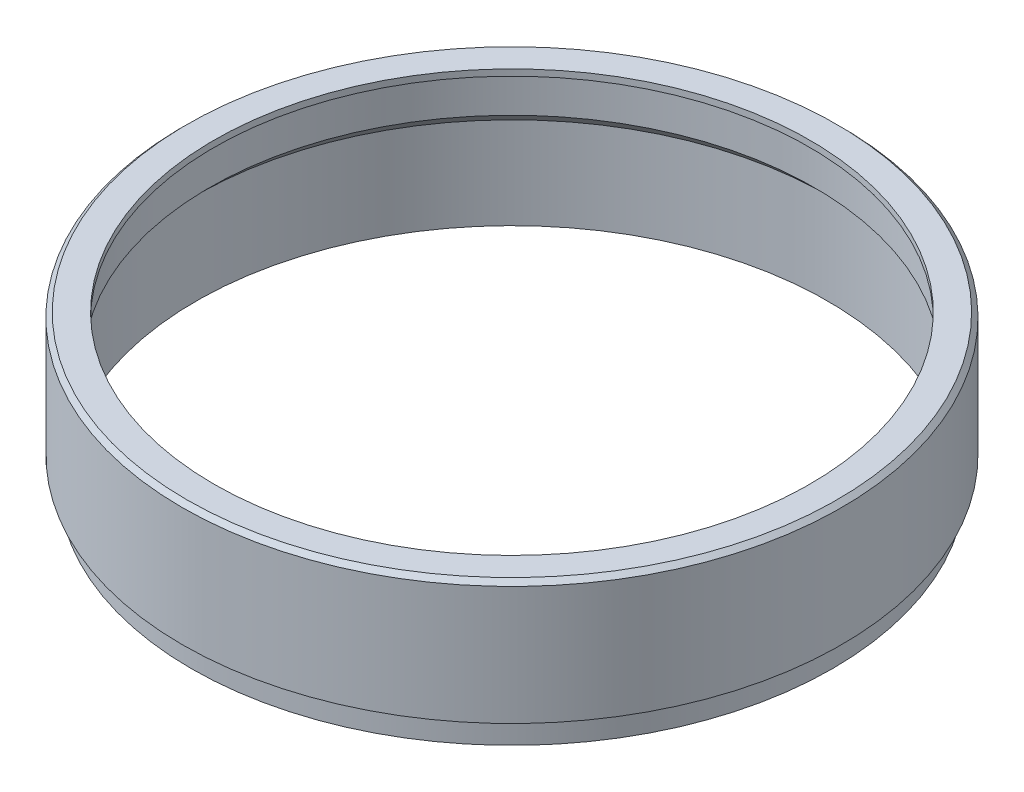
ISO-10303-21;
HEADER;
FILE_DESCRIPTION(('STEP AP214'),'2;1');
FILE_NAME('part.step','',(''),(''),'','','');
FILE_SCHEMA(('AUTOMOTIVE_DESIGN { 1 0 10303 214 1 1 1 1 }'));
ENDSEC;
DATA;
#1=APPLICATION_CONTEXT('core data for automotive mechanical design processes');
#2=APPLICATION_PROTOCOL_DEFINITION('international standard','automotive_design',2000,#1);
#3=PRODUCT_CONTEXT('',#1,'mechanical');
#4=PRODUCT('Part','Part','',(#3));
#5=PRODUCT_RELATED_PRODUCT_CATEGORY('part','',(#4));
#6=PRODUCT_DEFINITION_FORMATION('','',#4);
#7=PRODUCT_DEFINITION_CONTEXT('part definition',#1,'design');
#8=PRODUCT_DEFINITION('design','',#6,#7);
#9=PRODUCT_DEFINITION_SHAPE('','',#8);
#10=(LENGTH_UNIT() NAMED_UNIT(*) SI_UNIT(.MILLI.,.METRE.));
#11=(NAMED_UNIT(*) PLANE_ANGLE_UNIT() SI_UNIT($,.RADIAN.));
#12=(NAMED_UNIT(*) SI_UNIT($,.STERADIAN.) SOLID_ANGLE_UNIT());
#13=UNCERTAINTY_MEASURE_WITH_UNIT(LENGTH_MEASURE(1.E-05),#10,'distance_accuracy_value','');
#14=(GEOMETRIC_REPRESENTATION_CONTEXT(3) GLOBAL_UNCERTAINTY_ASSIGNED_CONTEXT((#13)) GLOBAL_UNIT_ASSIGNED_CONTEXT((#10,
#11,#12)) REPRESENTATION_CONTEXT('',''));
#15=CARTESIAN_POINT('',(0.,0.,0.));
#16=DIRECTION('',(0.,0.,1.));
#17=DIRECTION('',(1.,0.,0.));
#18=AXIS2_PLACEMENT_3D('',#15,#16,#17);
#19=CARTESIAN_POINT('',(-35.5,3.2,0.));
#20=DIRECTION('',(0.,-1.,0.));
#21=DIRECTION('',(0.,0.,-1.));
#22=AXIS2_PLACEMENT_3D('',#19,#20,#21);
#23=PLANE('',#22);
#24=CARTESIAN_POINT('',(0.,3.2,0.));
#25=DIRECTION('',(0.,1.,0.));
#26=DIRECTION('',(0.,0.,1.));
#27=AXIS2_PLACEMENT_3D('',#24,#25,#26);
#28=CIRCLE('',#27,35.);
#29=CARTESIAN_POINT('',(0.,3.2,35.));
#30=VERTEX_POINT('',#29);
#31=EDGE_CURVE('E10',#30,#30,#28,.T.);
#32=ORIENTED_EDGE('',*,*,#31,.T.);
#33=EDGE_LOOP('',(#32));
#34=FACE_BOUND('',#33,.T.);
#35=CARTESIAN_POINT('',(0.,3.2,0.));
#36=DIRECTION('',(0.,1.,0.));
#37=DIRECTION('',(0.,0.,1.));
#38=AXIS2_PLACEMENT_3D('',#35,#36,#37);
#39=CIRCLE('',#38,35.5);
#40=CARTESIAN_POINT('',(0.,3.2,35.5));
#41=VERTEX_POINT('',#40);
#42=EDGE_CURVE('E68',#41,#41,#39,.T.);
#43=ORIENTED_EDGE('',*,*,#42,.F.);
#44=EDGE_LOOP('',(#43));
#45=FACE_BOUND('',#44,.T.);
#46=ADVANCED_FACE('F31',(#34,#45),#23,.T.);
#47=CARTESIAN_POINT('',(0.,0.,0.));
#48=DIRECTION('',(0.,1.,0.));
#49=DIRECTION('',(0.,0.,1.));
#50=AXIS2_PLACEMENT_3D('',#47,#48,#49);
#51=CYLINDRICAL_SURFACE('',#50,35.);
#52=CARTESIAN_POINT('',(0.,13.35,0.));
#53=DIRECTION('',(0.,1.,0.));
#54=DIRECTION('',(0.,0.,1.));
#55=AXIS2_PLACEMENT_3D('',#52,#53,#54);
#56=CIRCLE('',#55,35.);
#57=CARTESIAN_POINT('',(0.,13.35,35.));
#58=VERTEX_POINT('',#57);
#59=EDGE_CURVE('E37',#58,#58,#56,.T.);
#60=ORIENTED_EDGE('',*,*,#59,.T.);
#61=EDGE_LOOP('',(#60));
#62=FACE_BOUND('',#61,.T.);
#63=ORIENTED_EDGE('',*,*,#31,.F.);
#64=EDGE_LOOP('',(#63));
#65=FACE_BOUND('',#64,.T.);
#66=ADVANCED_FACE('F76',(#62,#65),#51,.F.);
#67=CARTESIAN_POINT('',(0.,13.35,0.));
#68=DIRECTION('',(0.,-1.,0.));
#69=DIRECTION('',(0.,0.,-1.));
#70=AXIS2_PLACEMENT_3D('',#67,#68,#69);
#71=CONICAL_SURFACE('',#70,35.,0.785398163397453);
#72=CARTESIAN_POINT('',(0.,14.85,0.));
#73=DIRECTION('',(0.,1.,0.));
#74=DIRECTION('',(0.,0.,1.));
#75=AXIS2_PLACEMENT_3D('',#72,#73,#74);
#76=CIRCLE('',#75,33.5);
#77=CARTESIAN_POINT('',(0.,14.85,33.5));
#78=VERTEX_POINT('',#77);
#79=EDGE_CURVE('E41',#78,#78,#76,.T.);
#80=ORIENTED_EDGE('',*,*,#79,.T.);
#81=EDGE_LOOP('',(#80));
#82=FACE_BOUND('',#81,.T.);
#83=ORIENTED_EDGE('',*,*,#59,.F.);
#84=EDGE_LOOP('',(#83));
#85=FACE_BOUND('',#84,.T.);
#86=ADVANCED_FACE('F80',(#82,#85),#71,.F.);
#87=CARTESIAN_POINT('',(0.,0.,0.));
#88=DIRECTION('',(0.,1.,0.));
#89=DIRECTION('',(0.,0.,1.));
#90=AXIS2_PLACEMENT_3D('',#87,#88,#89);
#91=CYLINDRICAL_SURFACE('',#90,33.5);
#92=CARTESIAN_POINT('',(0.,18.95,0.));
#93=DIRECTION('',(0.,1.,0.));
#94=DIRECTION('',(0.,0.,1.));
#95=AXIS2_PLACEMENT_3D('',#92,#93,#94);
#96=CIRCLE('',#95,33.5);
#97=CARTESIAN_POINT('',(0.,18.95,33.5));
#98=VERTEX_POINT('',#97);
#99=EDGE_CURVE('E45',#98,#98,#96,.T.);
#100=ORIENTED_EDGE('',*,*,#99,.T.);
#101=EDGE_LOOP('',(#100));
#102=FACE_BOUND('',#101,.T.);
#103=ORIENTED_EDGE('',*,*,#79,.F.);
#104=EDGE_LOOP('',(#103));
#105=FACE_BOUND('',#104,.T.);
#106=ADVANCED_FACE('F84',(#102,#105),#91,.F.);
#107=CARTESIAN_POINT('',(-33.5,18.95,0.));
#108=DIRECTION('',(0.,-1.,0.));
#109=DIRECTION('',(0.,0.,-1.));
#110=AXIS2_PLACEMENT_3D('',#107,#108,#109);
#111=PLANE('',#110);
#112=CARTESIAN_POINT('',(0.,18.95,0.));
#113=DIRECTION('',(0.,1.,0.));
#114=DIRECTION('',(0.,0.,1.));
#115=AXIS2_PLACEMENT_3D('',#112,#113,#114);
#116=CIRCLE('',#115,33.);
#117=CARTESIAN_POINT('',(0.,18.95,33.));
#118=VERTEX_POINT('',#117);
#119=EDGE_CURVE('E50',#118,#118,#116,.T.);
#120=ORIENTED_EDGE('',*,*,#119,.T.);
#121=EDGE_LOOP('',(#120));
#122=FACE_BOUND('',#121,.T.);
#123=ORIENTED_EDGE('',*,*,#99,.F.);
#124=EDGE_LOOP('',(#123));
#125=FACE_BOUND('',#124,.T.);
#126=ADVANCED_FACE('F91',(#122,#125),#111,.T.);
#127=CARTESIAN_POINT('',(0.,0.,0.));
#128=DIRECTION('',(0.,1.,0.));
#129=DIRECTION('',(0.,0.,1.));
#130=AXIS2_PLACEMENT_3D('',#127,#128,#129);
#131=CYLINDRICAL_SURFACE('',#130,33.);
#132=CARTESIAN_POINT('',(0.,19.65,0.));
#133=DIRECTION('',(0.,1.,0.));
#134=DIRECTION('',(0.,0.,1.));
#135=AXIS2_PLACEMENT_3D('',#132,#133,#134);
#136=CIRCLE('',#135,33.);
#137=CARTESIAN_POINT('',(0.,19.65,33.));
#138=VERTEX_POINT('',#137);
#139=EDGE_CURVE('E53',#138,#138,#136,.T.);
#140=ORIENTED_EDGE('',*,*,#139,.T.);
#141=EDGE_LOOP('',(#140));
#142=FACE_BOUND('',#141,.T.);
#143=ORIENTED_EDGE('',*,*,#119,.F.);
#144=EDGE_LOOP('',(#143));
#145=FACE_BOUND('',#144,.T.);
#146=ADVANCED_FACE('F95',(#142,#145),#131,.F.);
#147=CARTESIAN_POINT('',(-33.,19.65,0.));
#148=DIRECTION('',(0.,1.,0.));
#149=DIRECTION('',(0.,0.,1.));
#150=AXIS2_PLACEMENT_3D('',#147,#148,#149);
#151=PLANE('',#150);
#152=CARTESIAN_POINT('',(0.,19.65,0.));
#153=DIRECTION('',(0.,1.,0.));
#154=DIRECTION('',(0.,0.,1.));
#155=AXIS2_PLACEMENT_3D('',#152,#153,#154);
#156=CIRCLE('',#155,36.);
#157=CARTESIAN_POINT('',(0.,19.65,36.));
#158=VERTEX_POINT('',#157);
#159=EDGE_CURVE('E56',#158,#158,#156,.T.);
#160=ORIENTED_EDGE('',*,*,#159,.T.);
#161=EDGE_LOOP('',(#160));
#162=FACE_BOUND('',#161,.T.);
#163=ORIENTED_EDGE('',*,*,#139,.F.);
#164=EDGE_LOOP('',(#163));
#165=FACE_BOUND('',#164,.T.);
#166=ADVANCED_FACE('F99',(#162,#165),#151,.T.);
#167=CARTESIAN_POINT('',(0.,19.65,0.));
#168=DIRECTION('',(0.,-1.,0.));
#169=DIRECTION('',(0.,0.,-1.));
#170=AXIS2_PLACEMENT_3D('',#167,#168,#169);
#171=CONICAL_SURFACE('',#170,36.,0.785398163397448);
#172=CARTESIAN_POINT('',(0.,19.15,0.));
#173=DIRECTION('',(0.,1.,0.));
#174=DIRECTION('',(0.,0.,1.));
#175=AXIS2_PLACEMENT_3D('',#172,#173,#174);
#176=CIRCLE('',#175,36.5);
#177=CARTESIAN_POINT('',(0.,19.15,36.5));
#178=VERTEX_POINT('',#177);
#179=EDGE_CURVE('E59',#178,#178,#176,.T.);
#180=ORIENTED_EDGE('',*,*,#179,.T.);
#181=EDGE_LOOP('',(#180));
#182=FACE_BOUND('',#181,.T.);
#183=ORIENTED_EDGE('',*,*,#159,.F.);
#184=EDGE_LOOP('',(#183));
#185=FACE_BOUND('',#184,.T.);
#186=ADVANCED_FACE('F103',(#182,#185),#171,.T.);
#187=CARTESIAN_POINT('',(0.,0.,0.));
#188=DIRECTION('',(0.,1.,0.));
#189=DIRECTION('',(0.,0.,1.));
#190=AXIS2_PLACEMENT_3D('',#187,#188,#189);
#191=CYLINDRICAL_SURFACE('',#190,36.5);
#192=CARTESIAN_POINT('',(0.,6.,0.));
#193=DIRECTION('',(0.,1.,0.));
#194=DIRECTION('',(0.,0.,1.));
#195=AXIS2_PLACEMENT_3D('',#192,#193,#194);
#196=CIRCLE('',#195,36.5);
#197=CARTESIAN_POINT('',(0.,6.,36.5));
#198=VERTEX_POINT('',#197);
#199=EDGE_CURVE('E62',#198,#198,#196,.T.);
#200=ORIENTED_EDGE('',*,*,#199,.T.);
#201=EDGE_LOOP('',(#200));
#202=FACE_BOUND('',#201,.T.);
#203=ORIENTED_EDGE('',*,*,#179,.F.);
#204=EDGE_LOOP('',(#203));
#205=FACE_BOUND('',#204,.T.);
#206=ADVANCED_FACE('F107',(#202,#205),#191,.T.);
#207=CARTESIAN_POINT('',(-36.5,6.,0.));
#208=DIRECTION('',(0.,-1.,0.));
#209=DIRECTION('',(0.,0.,-1.));
#210=AXIS2_PLACEMENT_3D('',#207,#208,#209);
#211=PLANE('',#210);
#212=CARTESIAN_POINT('',(0.,6.,0.));
#213=DIRECTION('',(0.,1.,0.));
#214=DIRECTION('',(0.,0.,1.));
#215=AXIS2_PLACEMENT_3D('',#212,#213,#214);
#216=CIRCLE('',#215,35.5);
#217=CARTESIAN_POINT('',(0.,6.,35.5));
#218=VERTEX_POINT('',#217);
#219=EDGE_CURVE('E65',#218,#218,#216,.T.);
#220=ORIENTED_EDGE('',*,*,#219,.T.);
#221=EDGE_LOOP('',(#220));
#222=FACE_BOUND('',#221,.T.);
#223=ORIENTED_EDGE('',*,*,#199,.F.);
#224=EDGE_LOOP('',(#223));
#225=FACE_BOUND('',#224,.T.);
#226=ADVANCED_FACE('F111',(#222,#225),#211,.T.);
#227=CARTESIAN_POINT('',(0.,0.,0.));
#228=DIRECTION('',(0.,1.,0.));
#229=DIRECTION('',(0.,0.,1.));
#230=AXIS2_PLACEMENT_3D('',#227,#228,#229);
#231=CYLINDRICAL_SURFACE('',#230,35.5);
#232=ORIENTED_EDGE('',*,*,#42,.T.);
#233=EDGE_LOOP('',(#232));
#234=FACE_BOUND('',#233,.T.);
#235=ORIENTED_EDGE('',*,*,#219,.F.);
#236=EDGE_LOOP('',(#235));
#237=FACE_BOUND('',#236,.T.);
#238=ADVANCED_FACE('F72',(#234,#237),#231,.T.);
#239=CLOSED_SHELL('',(#46,#66,#86,#106,#126,#146,#166,#186,#206,#226,#238));
#240=MANIFOLD_SOLID_BREP('B2',#239);
#241=ADVANCED_BREP_SHAPE_REPRESENTATION('',(#18,#240),#14);
#242=SHAPE_DEFINITION_REPRESENTATION(#9,#241);
ENDSEC;
END-ISO-10303-21;
